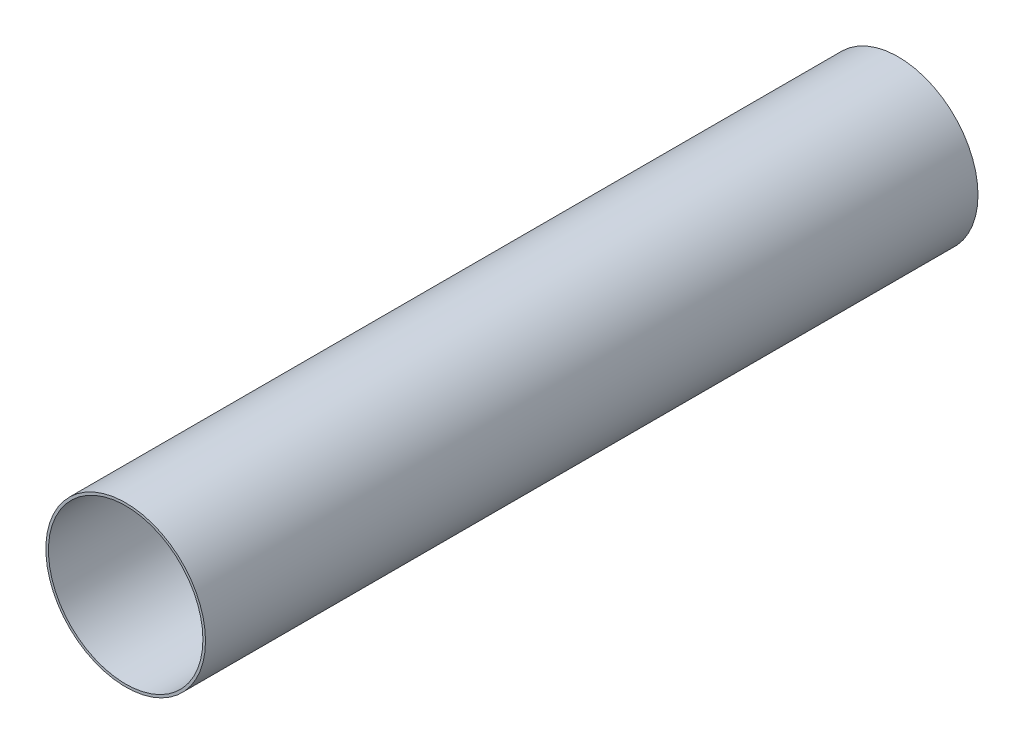
ISO-10303-21;
HEADER;
FILE_DESCRIPTION(('STEP AP214'),'2;1');
FILE_NAME('part.step','',(''),(''),'','','');
FILE_SCHEMA(('AUTOMOTIVE_DESIGN { 1 0 10303 214 1 1 1 1 }'));
ENDSEC;
DATA;
#1=APPLICATION_CONTEXT('core data for automotive mechanical design processes');
#2=APPLICATION_PROTOCOL_DEFINITION('international standard','automotive_design',2000,#1);
#3=PRODUCT_CONTEXT('',#1,'mechanical');
#4=PRODUCT('Part','Part','',(#3));
#5=PRODUCT_RELATED_PRODUCT_CATEGORY('part','',(#4));
#6=PRODUCT_DEFINITION_FORMATION('','',#4);
#7=PRODUCT_DEFINITION_CONTEXT('part definition',#1,'design');
#8=PRODUCT_DEFINITION('design','',#6,#7);
#9=PRODUCT_DEFINITION_SHAPE('','',#8);
#10=(LENGTH_UNIT() NAMED_UNIT(*) SI_UNIT(.MILLI.,.METRE.));
#11=(NAMED_UNIT(*) PLANE_ANGLE_UNIT() SI_UNIT($,.RADIAN.));
#12=(NAMED_UNIT(*) SI_UNIT($,.STERADIAN.) SOLID_ANGLE_UNIT());
#13=UNCERTAINTY_MEASURE_WITH_UNIT(LENGTH_MEASURE(1.E-05),#10,'distance_accuracy_value','');
#14=(GEOMETRIC_REPRESENTATION_CONTEXT(3) GLOBAL_UNCERTAINTY_ASSIGNED_CONTEXT((#13)) GLOBAL_UNIT_ASSIGNED_CONTEXT((#10,
#11,#12)) REPRESENTATION_CONTEXT('',''));
#15=CARTESIAN_POINT('',(0.,0.,0.));
#16=DIRECTION('',(0.,0.,1.));
#17=DIRECTION('',(1.,0.,0.));
#18=AXIS2_PLACEMENT_3D('',#15,#16,#17);
#19=CARTESIAN_POINT('',(0.,0.,1500.));
#20=DIRECTION('',(0.,0.,1.));
#21=DIRECTION('',(1.,0.,0.));
#22=AXIS2_PLACEMENT_3D('',#19,#20,#21);
#23=PLANE('',#22);
#24=CARTESIAN_POINT('',(0.,0.,1500.));
#25=DIRECTION('',(0.,0.,1.));
#26=DIRECTION('',(1.,0.,0.));
#27=AXIS2_PLACEMENT_3D('',#24,#25,#26);
#28=CIRCLE('',#27,155.);
#29=CARTESIAN_POINT('',(155.,0.,1500.));
#30=VERTEX_POINT('',#29);
#31=EDGE_CURVE('E10',#30,#30,#28,.T.);
#32=ORIENTED_EDGE('',*,*,#31,.T.);
#33=EDGE_LOOP('',(#32));
#34=FACE_BOUND('',#33,.T.);
#35=CARTESIAN_POINT('',(0.,0.,1500.));
#36=DIRECTION('',(0.,0.,1.));
#37=DIRECTION('',(1.,0.,0.));
#38=AXIS2_PLACEMENT_3D('',#35,#36,#37);
#39=CIRCLE('',#38,150.);
#40=CARTESIAN_POINT('',(150.,0.,1500.));
#41=VERTEX_POINT('',#40);
#42=EDGE_CURVE('E50',#41,#41,#39,.T.);
#43=ORIENTED_EDGE('',*,*,#42,.F.);
#44=EDGE_LOOP('',(#43));
#45=FACE_BOUND('',#44,.T.);
#46=ADVANCED_FACE('F39',(#34,#45),#23,.T.);
#47=CARTESIAN_POINT('',(0.,0.,0.));
#48=DIRECTION('',(0.,0.,1.));
#49=DIRECTION('',(1.,0.,0.));
#50=AXIS2_PLACEMENT_3D('',#47,#48,#49);
#51=PLANE('',#50);
#52=CARTESIAN_POINT('',(0.,0.,0.));
#53=DIRECTION('',(0.,0.,1.));
#54=DIRECTION('',(1.,0.,0.));
#55=AXIS2_PLACEMENT_3D('',#52,#53,#54);
#56=CIRCLE('',#55,155.);
#57=CARTESIAN_POINT('',(155.,0.,0.));
#58=VERTEX_POINT('',#57);
#59=EDGE_CURVE('E43',#58,#58,#56,.T.);
#60=ORIENTED_EDGE('',*,*,#59,.F.);
#61=EDGE_LOOP('',(#60));
#62=FACE_BOUND('',#61,.T.);
#63=CARTESIAN_POINT('',(0.,0.,0.));
#64=DIRECTION('',(0.,0.,1.));
#65=DIRECTION('',(1.,0.,0.));
#66=AXIS2_PLACEMENT_3D('',#63,#64,#65);
#67=CIRCLE('',#66,150.);
#68=CARTESIAN_POINT('',(150.,0.,0.));
#69=VERTEX_POINT('',#68);
#70=EDGE_CURVE('E52',#69,#69,#67,.T.);
#71=ORIENTED_EDGE('',*,*,#70,.T.);
#72=EDGE_LOOP('',(#71));
#73=FACE_BOUND('',#72,.T.);
#74=ADVANCED_FACE('F62',(#62,#73),#51,.F.);
#75=CARTESIAN_POINT('',(0.,0.,1500.));
#76=DIRECTION('',(0.,0.,-1.));
#77=DIRECTION('',(-1.,0.,0.));
#78=AXIS2_PLACEMENT_3D('',#75,#76,#77);
#79=CYLINDRICAL_SURFACE('',#78,155.);
#80=ORIENTED_EDGE('',*,*,#31,.F.);
#81=EDGE_LOOP('',(#80));
#82=FACE_BOUND('',#81,.T.);
#83=ORIENTED_EDGE('',*,*,#59,.T.);
#84=EDGE_LOOP('',(#83));
#85=FACE_BOUND('',#84,.T.);
#86=ADVANCED_FACE('F41',(#82,#85),#79,.T.);
#87=CARTESIAN_POINT('',(0.,0.,1500.));
#88=DIRECTION('',(0.,0.,-1.));
#89=DIRECTION('',(-1.,0.,0.));
#90=AXIS2_PLACEMENT_3D('',#87,#88,#89);
#91=CYLINDRICAL_SURFACE('',#90,150.);
#92=ORIENTED_EDGE('',*,*,#42,.T.);
#93=EDGE_LOOP('',(#92));
#94=FACE_BOUND('',#93,.T.);
#95=ORIENTED_EDGE('',*,*,#70,.F.);
#96=EDGE_LOOP('',(#95));
#97=FACE_BOUND('',#96,.T.);
#98=ADVANCED_FACE('F58',(#94,#97),#91,.F.);
#99=CLOSED_SHELL('',(#46,#74,#86,#98));
#100=MANIFOLD_SOLID_BREP('B2',#99);
#101=ADVANCED_BREP_SHAPE_REPRESENTATION('',(#18,#100),#14);
#102=SHAPE_DEFINITION_REPRESENTATION(#9,#101);
ENDSEC;
END-ISO-10303-21;
